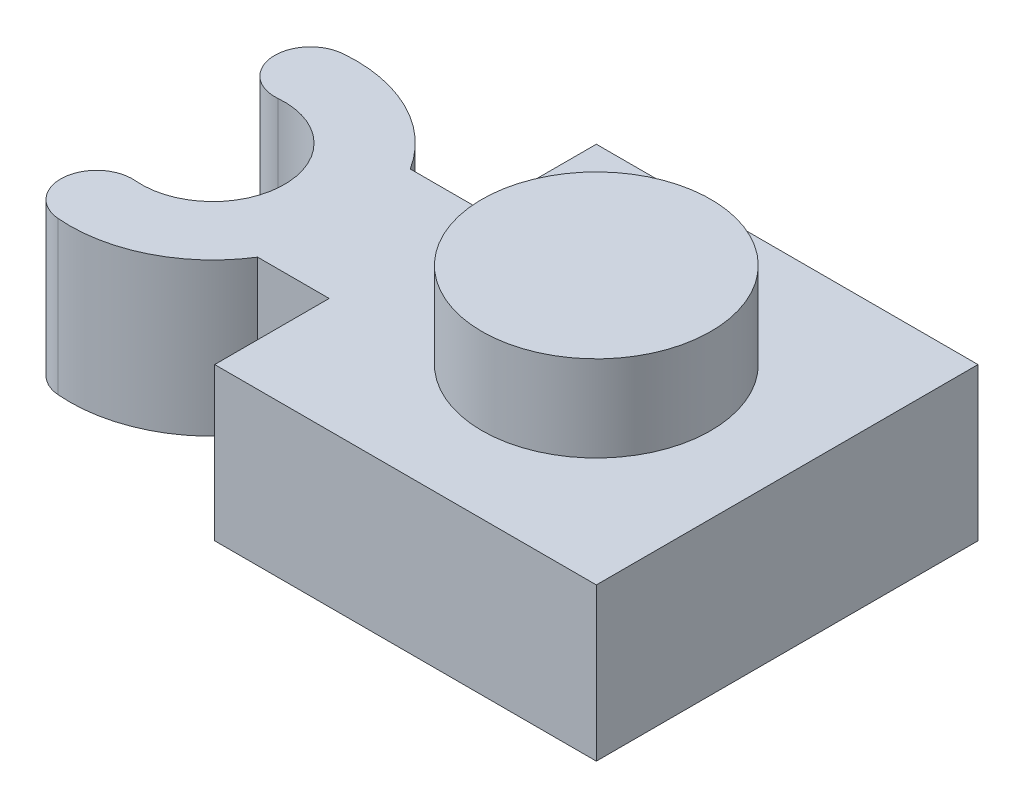
ISO-10303-21;
HEADER;
FILE_DESCRIPTION(('STEP AP214'),'2;1');
FILE_NAME('part.step','',(''),(''),'','','');
FILE_SCHEMA(('AUTOMOTIVE_DESIGN { 1 0 10303 214 1 1 1 1 }'));
ENDSEC;
DATA;
#1=APPLICATION_CONTEXT('core data for automotive mechanical design processes');
#2=APPLICATION_PROTOCOL_DEFINITION('international standard','automotive_design',2000,#1);
#3=PRODUCT_CONTEXT('',#1,'mechanical');
#4=PRODUCT('Part','Part','',(#3));
#5=PRODUCT_RELATED_PRODUCT_CATEGORY('part','',(#4));
#6=PRODUCT_DEFINITION_FORMATION('','',#4);
#7=PRODUCT_DEFINITION_CONTEXT('part definition',#1,'design');
#8=PRODUCT_DEFINITION('design','',#6,#7);
#9=PRODUCT_DEFINITION_SHAPE('','',#8);
#10=(LENGTH_UNIT() NAMED_UNIT(*) SI_UNIT(.MILLI.,.METRE.));
#11=(NAMED_UNIT(*) PLANE_ANGLE_UNIT() SI_UNIT($,.RADIAN.));
#12=(NAMED_UNIT(*) SI_UNIT($,.STERADIAN.) SOLID_ANGLE_UNIT());
#13=UNCERTAINTY_MEASURE_WITH_UNIT(LENGTH_MEASURE(1.E-05),#10,'distance_accuracy_value','');
#14=(GEOMETRIC_REPRESENTATION_CONTEXT(3) GLOBAL_UNCERTAINTY_ASSIGNED_CONTEXT((#13)) GLOBAL_UNIT_ASSIGNED_CONTEXT((#10,
#11,#12)) REPRESENTATION_CONTEXT('',''));
#15=CARTESIAN_POINT('',(0.,0.,0.));
#16=DIRECTION('',(0.,0.,1.));
#17=DIRECTION('',(1.,0.,0.));
#18=AXIS2_PLACEMENT_3D('',#15,#16,#17);
#19=CARTESIAN_POINT('',(0.,3.2,0.));
#20=DIRECTION('',(1.,0.,0.));
#21=DIRECTION('',(0.,0.,-1.));
#22=AXIS2_PLACEMENT_3D('',#19,#20,#21);
#23=PLANE('',#22);
#24=DIRECTION('',(0.,0.,1.));
#25=VECTOR('',#24,1.);
#26=CARTESIAN_POINT('',(0.,0.,0.));
#27=LINE('',#26,#25);
#28=CARTESIAN_POINT('',(0.,0.,-2.4));
#29=VERTEX_POINT('',#28);
#30=CARTESIAN_POINT('',(0.,0.,0.));
#31=VERTEX_POINT('',#30);
#32=EDGE_CURVE('E179',#29,#31,#27,.T.);
#33=ORIENTED_EDGE('',*,*,#32,.T.);
#34=DIRECTION('',(0.,-1.,0.));
#35=VECTOR('',#34,1.);
#36=CARTESIAN_POINT('',(0.,3.2,0.));
#37=LINE('',#36,#35);
#38=CARTESIAN_POINT('',(0.,3.2,0.));
#39=VERTEX_POINT('',#38);
#40=EDGE_CURVE('E11',#39,#31,#37,.T.);
#41=ORIENTED_EDGE('',*,*,#40,.F.);
#42=DIRECTION('',(0.,0.,1.));
#43=VECTOR('',#42,1.);
#44=CARTESIAN_POINT('',(0.,3.2,0.));
#45=LINE('',#44,#43);
#46=CARTESIAN_POINT('',(0.,3.2,-2.4));
#47=VERTEX_POINT('',#46);
#48=EDGE_CURVE('E215',#47,#39,#45,.T.);
#49=ORIENTED_EDGE('',*,*,#48,.F.);
#50=DIRECTION('',(0.,-1.,0.));
#51=VECTOR('',#50,1.);
#52=CARTESIAN_POINT('',(0.,3.2,-2.4));
#53=LINE('',#52,#51);
#54=EDGE_CURVE('E175',#47,#29,#53,.T.);
#55=ORIENTED_EDGE('',*,*,#54,.T.);
#56=EDGE_LOOP('',(#33,#41,#49,#55));
#57=FACE_BOUND('',#56,.T.);
#58=ADVANCED_FACE('F42',(#57),#23,.F.);
#59=CARTESIAN_POINT('',(0.,3.2,0.));
#60=DIRECTION('',(0.,0.,-1.));
#61=DIRECTION('',(-1.,0.,0.));
#62=AXIS2_PLACEMENT_3D('',#59,#60,#61);
#63=PLANE('',#62);
#64=DIRECTION('',(1.,0.,0.));
#65=VECTOR('',#64,1.);
#66=CARTESIAN_POINT('',(0.,0.,0.));
#67=LINE('',#66,#65);
#68=CARTESIAN_POINT('',(8.,0.,0.));
#69=VERTEX_POINT('',#68);
#70=EDGE_CURVE('E183',#31,#69,#67,.T.);
#71=ORIENTED_EDGE('',*,*,#70,.T.);
#72=DIRECTION('',(0.,-1.,0.));
#73=VECTOR('',#72,1.);
#74=CARTESIAN_POINT('',(8.,3.2,0.));
#75=LINE('',#74,#73);
#76=CARTESIAN_POINT('',(8.,3.2,0.));
#77=VERTEX_POINT('',#76);
#78=EDGE_CURVE('E50',#77,#69,#75,.T.);
#79=ORIENTED_EDGE('',*,*,#78,.F.);
#80=DIRECTION('',(1.,0.,0.));
#81=VECTOR('',#80,1.);
#82=CARTESIAN_POINT('',(0.,3.2,0.));
#83=LINE('',#82,#81);
#84=EDGE_CURVE('E119',#39,#77,#83,.T.);
#85=ORIENTED_EDGE('',*,*,#84,.F.);
#86=ORIENTED_EDGE('',*,*,#40,.T.);
#87=EDGE_LOOP('',(#71,#79,#85,#86));
#88=FACE_BOUND('',#87,.T.);
#89=ADVANCED_FACE('F395',(#88),#63,.F.);
#90=CARTESIAN_POINT('',(8.,3.2,0.));
#91=DIRECTION('',(-1.,0.,0.));
#92=DIRECTION('',(0.,0.,1.));
#93=AXIS2_PLACEMENT_3D('',#90,#91,#92);
#94=PLANE('',#93);
#95=DIRECTION('',(0.,0.,-1.));
#96=VECTOR('',#95,1.);
#97=CARTESIAN_POINT('',(8.,0.,0.));
#98=LINE('',#97,#96);
#99=CARTESIAN_POINT('',(8.,0.,-8.));
#100=VERTEX_POINT('',#99);
#101=EDGE_CURVE('E187',#69,#100,#98,.T.);
#102=ORIENTED_EDGE('',*,*,#101,.T.);
#103=DIRECTION('',(0.,-1.,0.));
#104=VECTOR('',#103,1.);
#105=CARTESIAN_POINT('',(8.,3.2,-8.));
#106=LINE('',#105,#104);
#107=CARTESIAN_POINT('',(8.,3.2,-8.));
#108=VERTEX_POINT('',#107);
#109=EDGE_CURVE('E242',#108,#100,#106,.T.);
#110=ORIENTED_EDGE('',*,*,#109,.F.);
#111=DIRECTION('',(0.,0.,-1.));
#112=VECTOR('',#111,1.);
#113=CARTESIAN_POINT('',(8.,3.2,0.));
#114=LINE('',#113,#112);
#115=EDGE_CURVE('E252',#77,#108,#114,.T.);
#116=ORIENTED_EDGE('',*,*,#115,.F.);
#117=ORIENTED_EDGE('',*,*,#78,.T.);
#118=EDGE_LOOP('',(#102,#110,#116,#117));
#119=FACE_BOUND('',#118,.T.);
#120=ADVANCED_FACE('F250',(#119),#94,.F.);
#121=CARTESIAN_POINT('',(0.,3.2,-8.));
#122=DIRECTION('',(0.,0.,1.));
#123=DIRECTION('',(1.,0.,0.));
#124=AXIS2_PLACEMENT_3D('',#121,#122,#123);
#125=PLANE('',#124);
#126=DIRECTION('',(-1.,0.,0.));
#127=VECTOR('',#126,1.);
#128=CARTESIAN_POINT('',(0.,0.,-8.));
#129=LINE('',#128,#127);
#130=CARTESIAN_POINT('',(0.,0.,-8.));
#131=VERTEX_POINT('',#130);
#132=EDGE_CURVE('E190',#100,#131,#129,.T.);
#133=ORIENTED_EDGE('',*,*,#132,.T.);
#134=DIRECTION('',(0.,-1.,0.));
#135=VECTOR('',#134,1.);
#136=CARTESIAN_POINT('',(0.,3.2,-8.));
#137=LINE('',#136,#135);
#138=CARTESIAN_POINT('',(0.,3.2,-8.));
#139=VERTEX_POINT('',#138);
#140=EDGE_CURVE('E238',#139,#131,#137,.T.);
#141=ORIENTED_EDGE('',*,*,#140,.F.);
#142=DIRECTION('',(-1.,0.,0.));
#143=VECTOR('',#142,1.);
#144=CARTESIAN_POINT('',(0.,3.2,-8.));
#145=LINE('',#144,#143);
#146=EDGE_CURVE('E271',#108,#139,#145,.T.);
#147=ORIENTED_EDGE('',*,*,#146,.F.);
#148=ORIENTED_EDGE('',*,*,#109,.T.);
#149=EDGE_LOOP('',(#133,#141,#147,#148));
#150=FACE_BOUND('',#149,.T.);
#151=ADVANCED_FACE('F261',(#150),#125,.F.);
#152=CARTESIAN_POINT('',(0.,3.2,-5.6));
#153=DIRECTION('',(1.,0.,0.));
#154=DIRECTION('',(0.,0.,-1.));
#155=AXIS2_PLACEMENT_3D('',#152,#153,#154);
#156=PLANE('',#155);
#157=DIRECTION('',(0.,0.,1.));
#158=VECTOR('',#157,1.);
#159=CARTESIAN_POINT('',(0.,0.,-5.6));
#160=LINE('',#159,#158);
#161=CARTESIAN_POINT('',(0.,0.,-5.6));
#162=VERTEX_POINT('',#161);
#163=EDGE_CURVE('E193',#131,#162,#160,.T.);
#164=ORIENTED_EDGE('',*,*,#163,.T.);
#165=DIRECTION('',(0.,-1.,0.));
#166=VECTOR('',#165,1.);
#167=CARTESIAN_POINT('',(0.,3.2,-5.6));
#168=LINE('',#167,#166);
#169=CARTESIAN_POINT('',(0.,3.2,-5.6));
#170=VERTEX_POINT('',#169);
#171=EDGE_CURVE('E234',#170,#162,#168,.T.);
#172=ORIENTED_EDGE('',*,*,#171,.F.);
#173=DIRECTION('',(0.,0.,1.));
#174=VECTOR('',#173,1.);
#175=CARTESIAN_POINT('',(0.,3.2,-5.6));
#176=LINE('',#175,#174);
#177=EDGE_CURVE('E267',#139,#170,#176,.T.);
#178=ORIENTED_EDGE('',*,*,#177,.F.);
#179=ORIENTED_EDGE('',*,*,#140,.T.);
#180=EDGE_LOOP('',(#164,#172,#178,#179));
#181=FACE_BOUND('',#180,.T.);
#182=ADVANCED_FACE('F265',(#181),#156,.F.);
#183=CARTESIAN_POINT('',(0.,3.2,-5.6));
#184=DIRECTION('',(0.,0.,1.));
#185=DIRECTION('',(1.,0.,0.));
#186=AXIS2_PLACEMENT_3D('',#183,#184,#185);
#187=PLANE('',#186);
#188=DIRECTION('',(-1.,0.,0.));
#189=VECTOR('',#188,1.);
#190=CARTESIAN_POINT('',(0.,0.,-5.6));
#191=LINE('',#190,#189);
#192=CARTESIAN_POINT('',(-1.5,0.,-5.6));
#193=VERTEX_POINT('',#192);
#194=EDGE_CURVE('E196',#162,#193,#191,.T.);
#195=ORIENTED_EDGE('',*,*,#194,.T.);
#196=DIRECTION('',(0.,-1.,0.));
#197=VECTOR('',#196,1.);
#198=CARTESIAN_POINT('',(-1.5,3.2,-5.6));
#199=LINE('',#198,#197);
#200=CARTESIAN_POINT('',(-1.5,3.2,-5.6));
#201=VERTEX_POINT('',#200);
#202=EDGE_CURVE('E230',#201,#193,#199,.T.);
#203=ORIENTED_EDGE('',*,*,#202,.F.);
#204=DIRECTION('',(-1.,0.,0.));
#205=VECTOR('',#204,1.);
#206=CARTESIAN_POINT('',(0.,3.2,-5.6));
#207=LINE('',#206,#205);
#208=EDGE_CURVE('E270',#170,#201,#207,.T.);
#209=ORIENTED_EDGE('',*,*,#208,.F.);
#210=ORIENTED_EDGE('',*,*,#171,.T.);
#211=EDGE_LOOP('',(#195,#203,#209,#210));
#212=FACE_BOUND('',#211,.T.);
#213=ADVANCED_FACE('F408',(#212),#187,.F.);
#214=CARTESIAN_POINT('',(-4.0377155080899,3.2,-4.));
#215=DIRECTION('',(0.,-1.,0.));
#216=DIRECTION('',(0.,0.,-1.));
#217=AXIS2_PLACEMENT_3D('',#214,#215,#216);
#218=CYLINDRICAL_SURFACE('',#217,3.);
#219=CARTESIAN_POINT('',(-4.0377155080899,0.,-4.));
#220=DIRECTION('',(0.,1.,0.));
#221=DIRECTION('',(0.,0.,1.));
#222=AXIS2_PLACEMENT_3D('',#219,#220,#221);
#223=CIRCLE('',#222,3.);
#224=CARTESIAN_POINT('',(-4.29918273633287,0.,-6.98858409427524));
#225=VERTEX_POINT('',#224);
#226=EDGE_CURVE('E199',#193,#225,#223,.T.);
#227=ORIENTED_EDGE('',*,*,#226,.T.);
#228=DIRECTION('',(0.,-1.,0.));
#229=VECTOR('',#228,1.);
#230=CARTESIAN_POINT('',(-4.29918273633287,3.2,-6.98858409427524));
#231=LINE('',#230,#229);
#232=CARTESIAN_POINT('',(-4.29918273633287,3.2,-6.98858409427524));
#233=VERTEX_POINT('',#232);
#234=EDGE_CURVE('E226',#233,#225,#231,.T.);
#235=ORIENTED_EDGE('',*,*,#234,.F.);
#236=CARTESIAN_POINT('',(-4.0377155080899,3.2,-4.));
#237=DIRECTION('',(0.,1.,0.));
#238=DIRECTION('',(0.,0.,1.));
#239=AXIS2_PLACEMENT_3D('',#236,#237,#238);
#240=CIRCLE('',#239,3.);
#241=EDGE_CURVE('E275',#201,#233,#240,.T.);
#242=ORIENTED_EDGE('',*,*,#241,.F.);
#243=ORIENTED_EDGE('',*,*,#202,.T.);
#244=EDGE_LOOP('',(#227,#235,#242,#243));
#245=FACE_BOUND('',#244,.T.);
#246=ADVANCED_FACE('F411',(#245),#218,.T.);
#247=CARTESIAN_POINT('',(-4.23381592927213,3.2,-6.24143807070644));
#248=DIRECTION('',(0.,-1.,0.));
#249=DIRECTION('',(0.,0.,-1.));
#250=AXIS2_PLACEMENT_3D('',#247,#248,#249);
#251=CYLINDRICAL_SURFACE('',#250,0.750000000000002);
#252=CARTESIAN_POINT('',(-4.23381592927213,0.,-6.24143807070644));
#253=DIRECTION('',(0.,1.,0.));
#254=DIRECTION('',(0.,0.,1.));
#255=AXIS2_PLACEMENT_3D('',#252,#253,#254);
#256=CIRCLE('',#255,0.750000000000002);
#257=CARTESIAN_POINT('',(-4.16844912221139,0.,-5.49429204713763));
#258=VERTEX_POINT('',#257);
#259=EDGE_CURVE('E202',#225,#258,#256,.T.);
#260=ORIENTED_EDGE('',*,*,#259,.T.);
#261=DIRECTION('',(0.,-1.,0.));
#262=VECTOR('',#261,1.);
#263=CARTESIAN_POINT('',(-4.16844912221139,3.2,-5.49429204713763));
#264=LINE('',#263,#262);
#265=CARTESIAN_POINT('',(-4.16844912221139,3.2,-5.49429204713763));
#266=VERTEX_POINT('',#265);
#267=EDGE_CURVE('E222',#266,#258,#264,.T.);
#268=ORIENTED_EDGE('',*,*,#267,.F.);
#269=CARTESIAN_POINT('',(-4.23381592927213,3.2,-6.24143807070644));
#270=DIRECTION('',(0.,1.,0.));
#271=DIRECTION('',(0.,0.,1.));
#272=AXIS2_PLACEMENT_3D('',#269,#270,#271);
#273=CIRCLE('',#272,0.750000000000002);
#274=EDGE_CURVE('E282',#233,#266,#273,.T.);
#275=ORIENTED_EDGE('',*,*,#274,.F.);
#276=ORIENTED_EDGE('',*,*,#234,.T.);
#277=EDGE_LOOP('',(#260,#268,#275,#276));
#278=FACE_BOUND('',#277,.T.);
#279=ADVANCED_FACE('F290',(#278),#251,.T.);
#280=CARTESIAN_POINT('',(-4.0377155080899,3.2,-4.));
#281=DIRECTION('',(0.,-1.,0.));
#282=DIRECTION('',(0.,0.,-1.));
#283=AXIS2_PLACEMENT_3D('',#280,#281,#282);
#284=CYLINDRICAL_SURFACE('',#283,1.5);
#285=CARTESIAN_POINT('',(-4.0377155080899,0.,-4.));
#286=DIRECTION('',(0.,-1.,0.));
#287=DIRECTION('',(0.,0.,1.));
#288=AXIS2_PLACEMENT_3D('',#285,#286,#287);
#289=CIRCLE('',#288,1.5);
#290=CARTESIAN_POINT('',(-4.16844912221139,0.,-2.50570795286238));
#291=VERTEX_POINT('',#290);
#292=EDGE_CURVE('E205',#258,#291,#289,.T.);
#293=ORIENTED_EDGE('',*,*,#292,.T.);
#294=DIRECTION('',(0.,-1.,0.));
#295=VECTOR('',#294,1.);
#296=CARTESIAN_POINT('',(-4.16844912221139,3.2,-2.50570795286238));
#297=LINE('',#296,#295);
#298=CARTESIAN_POINT('',(-4.16844912221139,3.2,-2.50570795286238));
#299=VERTEX_POINT('',#298);
#300=EDGE_CURVE('E168',#299,#291,#297,.T.);
#301=ORIENTED_EDGE('',*,*,#300,.F.);
#302=CARTESIAN_POINT('',(-4.0377155080899,3.2,-4.));
#303=DIRECTION('',(0.,-1.,0.));
#304=DIRECTION('',(0.,0.,1.));
#305=AXIS2_PLACEMENT_3D('',#302,#303,#304);
#306=CIRCLE('',#305,1.5);
#307=EDGE_CURVE('E154',#266,#299,#306,.T.);
#308=ORIENTED_EDGE('',*,*,#307,.F.);
#309=ORIENTED_EDGE('',*,*,#267,.T.);
#310=EDGE_LOOP('',(#293,#301,#308,#309));
#311=FACE_BOUND('',#310,.T.);
#312=ADVANCED_FACE('F294',(#311),#284,.F.);
#313=CARTESIAN_POINT('',(-4.23381592927213,3.2,-1.75856192929357));
#314=DIRECTION('',(0.,-1.,0.));
#315=DIRECTION('',(0.,0.,-1.));
#316=AXIS2_PLACEMENT_3D('',#313,#314,#315);
#317=CYLINDRICAL_SURFACE('',#316,0.75);
#318=CARTESIAN_POINT('',(-4.23381592927213,0.,-1.75856192929357));
#319=DIRECTION('',(0.,1.,0.));
#320=DIRECTION('',(0.,0.,1.));
#321=AXIS2_PLACEMENT_3D('',#318,#319,#320);
#322=CIRCLE('',#321,0.75);
#323=CARTESIAN_POINT('',(-4.29918273633287,0.,-1.01141590572476));
#324=VERTEX_POINT('',#323);
#325=EDGE_CURVE('E164',#291,#324,#322,.T.);
#326=ORIENTED_EDGE('',*,*,#325,.T.);
#327=DIRECTION('',(0.,-1.,0.));
#328=VECTOR('',#327,1.);
#329=CARTESIAN_POINT('',(-4.29918273633287,3.2,-1.01141590572476));
#330=LINE('',#329,#328);
#331=CARTESIAN_POINT('',(-4.29918273633287,3.2,-1.01141590572476));
#332=VERTEX_POINT('',#331);
#333=EDGE_CURVE('E161',#332,#324,#330,.T.);
#334=ORIENTED_EDGE('',*,*,#333,.F.);
#335=CARTESIAN_POINT('',(-4.23381592927213,3.2,-1.75856192929357));
#336=DIRECTION('',(0.,1.,0.));
#337=DIRECTION('',(0.,0.,1.));
#338=AXIS2_PLACEMENT_3D('',#335,#336,#337);
#339=CIRCLE('',#338,0.75);
#340=EDGE_CURVE('E147',#299,#332,#339,.T.);
#341=ORIENTED_EDGE('',*,*,#340,.F.);
#342=ORIENTED_EDGE('',*,*,#300,.T.);
#343=EDGE_LOOP('',(#326,#334,#341,#342));
#344=FACE_BOUND('',#343,.T.);
#345=ADVANCED_FACE('F162',(#344),#317,.T.);
#346=CARTESIAN_POINT('',(-4.0377155080899,3.2,-4.));
#347=DIRECTION('',(0.,-1.,0.));
#348=DIRECTION('',(0.,0.,-1.));
#349=AXIS2_PLACEMENT_3D('',#346,#347,#348);
#350=CYLINDRICAL_SURFACE('',#349,3.);
#351=CARTESIAN_POINT('',(-4.0377155080899,0.,-4.));
#352=DIRECTION('',(0.,1.,0.));
#353=DIRECTION('',(0.,0.,1.));
#354=AXIS2_PLACEMENT_3D('',#351,#352,#353);
#355=CIRCLE('',#354,3.);
#356=CARTESIAN_POINT('',(-1.5,0.,-2.4));
#357=VERTEX_POINT('',#356);
#358=EDGE_CURVE('E210',#324,#357,#355,.T.);
#359=ORIENTED_EDGE('',*,*,#358,.T.);
#360=DIRECTION('',(0.,-1.,0.));
#361=VECTOR('',#360,1.);
#362=CARTESIAN_POINT('',(-1.5,3.2,-2.4));
#363=LINE('',#362,#361);
#364=CARTESIAN_POINT('',(-1.5,3.2,-2.4));
#365=VERTEX_POINT('',#364);
#366=EDGE_CURVE('E169',#365,#357,#363,.T.);
#367=ORIENTED_EDGE('',*,*,#366,.F.);
#368=CARTESIAN_POINT('',(-4.0377155080899,3.2,-4.));
#369=DIRECTION('',(0.,1.,0.));
#370=DIRECTION('',(0.,0.,1.));
#371=AXIS2_PLACEMENT_3D('',#368,#369,#370);
#372=CIRCLE('',#371,3.);
#373=EDGE_CURVE('E151',#332,#365,#372,.T.);
#374=ORIENTED_EDGE('',*,*,#373,.F.);
#375=ORIENTED_EDGE('',*,*,#333,.T.);
#376=EDGE_LOOP('',(#359,#367,#374,#375));
#377=FACE_BOUND('',#376,.T.);
#378=ADVANCED_FACE('F171',(#377),#350,.T.);
#379=CARTESIAN_POINT('',(0.,3.2,-2.4));
#380=DIRECTION('',(0.,0.,-1.));
#381=DIRECTION('',(-1.,0.,0.));
#382=AXIS2_PLACEMENT_3D('',#379,#380,#381);
#383=PLANE('',#382);
#384=DIRECTION('',(1.,0.,0.));
#385=VECTOR('',#384,1.);
#386=CARTESIAN_POINT('',(0.,0.,-2.4));
#387=LINE('',#386,#385);
#388=EDGE_CURVE('E111',#357,#29,#387,.T.);
#389=ORIENTED_EDGE('',*,*,#388,.T.);
#390=ORIENTED_EDGE('',*,*,#54,.F.);
#391=DIRECTION('',(1.,0.,0.));
#392=VECTOR('',#391,1.);
#393=CARTESIAN_POINT('',(0.,3.2,-2.4));
#394=LINE('',#393,#392);
#395=EDGE_CURVE('E66',#365,#47,#394,.T.);
#396=ORIENTED_EDGE('',*,*,#395,.F.);
#397=ORIENTED_EDGE('',*,*,#366,.T.);
#398=EDGE_LOOP('',(#389,#390,#396,#397));
#399=FACE_BOUND('',#398,.T.);
#400=ADVANCED_FACE('F295',(#399),#383,.F.);
#401=CARTESIAN_POINT('',(-4.0377155080899,3.2,-4.));
#402=DIRECTION('',(0.,1.,0.));
#403=DIRECTION('',(0.,0.,1.));
#404=AXIS2_PLACEMENT_3D('',#401,#402,#403);
#405=PLANE('',#404);
#406=CARTESIAN_POINT('',(4.,3.2,-4.));
#407=DIRECTION('',(0.,1.,0.));
#408=DIRECTION('',(0.,0.,1.));
#409=AXIS2_PLACEMENT_3D('',#406,#407,#408);
#410=CIRCLE('',#409,2.4);
#411=CARTESIAN_POINT('',(4.,3.2,-1.6));
#412=VERTEX_POINT('',#411);
#413=EDGE_CURVE('E304',#412,#412,#410,.T.);
#414=ORIENTED_EDGE('',*,*,#413,.F.);
#415=EDGE_LOOP('',(#414));
#416=FACE_BOUND('',#415,.T.);
#417=ORIENTED_EDGE('',*,*,#48,.T.);
#418=ORIENTED_EDGE('',*,*,#84,.T.);
#419=ORIENTED_EDGE('',*,*,#115,.T.);
#420=ORIENTED_EDGE('',*,*,#146,.T.);
#421=ORIENTED_EDGE('',*,*,#177,.T.);
#422=ORIENTED_EDGE('',*,*,#208,.T.);
#423=ORIENTED_EDGE('',*,*,#241,.T.);
#424=ORIENTED_EDGE('',*,*,#274,.T.);
#425=ORIENTED_EDGE('',*,*,#307,.T.);
#426=ORIENTED_EDGE('',*,*,#340,.T.);
#427=ORIENTED_EDGE('',*,*,#373,.T.);
#428=ORIENTED_EDGE('',*,*,#395,.T.);
#429=EDGE_LOOP('',(#417,#418,#419,#420,#421,#422,#423,#424,#425,#426,#427,#428));
#430=FACE_BOUND('',#429,.T.);
#431=ADVANCED_FACE('F149',(#416,#430),#405,.T.);
#432=CARTESIAN_POINT('',(-4.0377155080899,0.,-4.));
#433=DIRECTION('',(0.,1.,0.));
#434=DIRECTION('',(0.,0.,1.));
#435=AXIS2_PLACEMENT_3D('',#432,#433,#434);
#436=PLANE('',#435);
#437=DIRECTION('',(1.,0.,0.));
#438=VECTOR('',#437,1.);
#439=CARTESIAN_POINT('',(1.6,0.,-6.4));
#440=LINE('',#439,#438);
#441=CARTESIAN_POINT('',(1.6,0.,-6.4));
#442=VERTEX_POINT('',#441);
#443=CARTESIAN_POINT('',(6.4,0.,-6.4));
#444=VERTEX_POINT('',#443);
#445=EDGE_CURVE('E336',#442,#444,#440,.T.);
#446=ORIENTED_EDGE('',*,*,#445,.F.);
#447=DIRECTION('',(0.,0.,-1.));
#448=VECTOR('',#447,1.);
#449=CARTESIAN_POINT('',(1.6,0.,-1.6));
#450=LINE('',#449,#448);
#451=CARTESIAN_POINT('',(1.6,0.,-1.6));
#452=VERTEX_POINT('',#451);
#453=EDGE_CURVE('E57',#452,#442,#450,.T.);
#454=ORIENTED_EDGE('',*,*,#453,.F.);
#455=DIRECTION('',(-1.,0.,0.));
#456=VECTOR('',#455,1.);
#457=CARTESIAN_POINT('',(1.6,0.,-1.6));
#458=LINE('',#457,#456);
#459=CARTESIAN_POINT('',(6.4,0.,-1.6));
#460=VERTEX_POINT('',#459);
#461=EDGE_CURVE('E327',#460,#452,#458,.T.);
#462=ORIENTED_EDGE('',*,*,#461,.F.);
#463=DIRECTION('',(0.,0.,1.));
#464=VECTOR('',#463,1.);
#465=CARTESIAN_POINT('',(6.4,0.,-1.6));
#466=LINE('',#465,#464);
#467=EDGE_CURVE('E332',#444,#460,#466,.T.);
#468=ORIENTED_EDGE('',*,*,#467,.F.);
#469=EDGE_LOOP('',(#446,#454,#462,#468));
#470=FACE_BOUND('',#469,.T.);
#471=ORIENTED_EDGE('',*,*,#32,.F.);
#472=ORIENTED_EDGE('',*,*,#388,.F.);
#473=ORIENTED_EDGE('',*,*,#358,.F.);
#474=ORIENTED_EDGE('',*,*,#325,.F.);
#475=ORIENTED_EDGE('',*,*,#292,.F.);
#476=ORIENTED_EDGE('',*,*,#259,.F.);
#477=ORIENTED_EDGE('',*,*,#226,.F.);
#478=ORIENTED_EDGE('',*,*,#194,.F.);
#479=ORIENTED_EDGE('',*,*,#163,.F.);
#480=ORIENTED_EDGE('',*,*,#132,.F.);
#481=ORIENTED_EDGE('',*,*,#101,.F.);
#482=ORIENTED_EDGE('',*,*,#70,.F.);
#483=EDGE_LOOP('',(#471,#472,#473,#474,#475,#476,#477,#478,#479,#480,#481,#482));
#484=FACE_BOUND('',#483,.T.);
#485=ADVANCED_FACE('F256',(#470,#484),#436,.F.);
#486=CARTESIAN_POINT('',(4.,5.,-4.));
#487=DIRECTION('',(0.,-1.,0.));
#488=DIRECTION('',(0.,0.,-1.));
#489=AXIS2_PLACEMENT_3D('',#486,#487,#488);
#490=CYLINDRICAL_SURFACE('',#489,2.4);
#491=CARTESIAN_POINT('',(4.,5.,-4.));
#492=DIRECTION('',(0.,1.,0.));
#493=DIRECTION('',(0.,0.,1.));
#494=AXIS2_PLACEMENT_3D('',#491,#492,#493);
#495=CIRCLE('',#494,2.4);
#496=CARTESIAN_POINT('',(4.,5.,-1.6));
#497=VERTEX_POINT('',#496);
#498=EDGE_CURVE('E184',#497,#497,#495,.T.);
#499=ORIENTED_EDGE('',*,*,#498,.F.);
#500=EDGE_LOOP('',(#499));
#501=FACE_BOUND('',#500,.T.);
#502=ORIENTED_EDGE('',*,*,#413,.T.);
#503=EDGE_LOOP('',(#502));
#504=FACE_BOUND('',#503,.T.);
#505=ADVANCED_FACE('F428',(#501,#504),#490,.T.);
#506=CARTESIAN_POINT('',(4.,5.,-4.));
#507=DIRECTION('',(0.,1.,0.));
#508=DIRECTION('',(0.,0.,1.));
#509=AXIS2_PLACEMENT_3D('',#506,#507,#508);
#510=PLANE('',#509);
#511=ORIENTED_EDGE('',*,*,#498,.T.);
#512=EDGE_LOOP('',(#511));
#513=FACE_BOUND('',#512,.T.);
#514=ADVANCED_FACE('F434',(#513),#510,.T.);
#515=CARTESIAN_POINT('',(1.6,1.8,-1.6));
#516=DIRECTION('',(-1.,0.,0.));
#517=DIRECTION('',(0.,0.,1.));
#518=AXIS2_PLACEMENT_3D('',#515,#516,#517);
#519=PLANE('',#518);
#520=ORIENTED_EDGE('',*,*,#453,.T.);
#521=DIRECTION('',(0.,-1.,0.));
#522=VECTOR('',#521,1.);
#523=CARTESIAN_POINT('',(1.6,1.8,-6.4));
#524=LINE('',#523,#522);
#525=CARTESIAN_POINT('',(1.6,1.8,-6.4));
#526=VERTEX_POINT('',#525);
#527=EDGE_CURVE('E313',#526,#442,#524,.T.);
#528=ORIENTED_EDGE('',*,*,#527,.F.);
#529=DIRECTION('',(0.,0.,-1.));
#530=VECTOR('',#529,1.);
#531=CARTESIAN_POINT('',(1.6,1.8,-1.6));
#532=LINE('',#531,#530);
#533=CARTESIAN_POINT('',(1.6,1.8,-1.6));
#534=VERTEX_POINT('',#533);
#535=EDGE_CURVE('E331',#534,#526,#532,.T.);
#536=ORIENTED_EDGE('',*,*,#535,.F.);
#537=DIRECTION('',(0.,-1.,0.));
#538=VECTOR('',#537,1.);
#539=CARTESIAN_POINT('',(1.6,1.8,-1.6));
#540=LINE('',#539,#538);
#541=EDGE_CURVE('E309',#534,#452,#540,.T.);
#542=ORIENTED_EDGE('',*,*,#541,.T.);
#543=EDGE_LOOP('',(#520,#528,#536,#542));
#544=FACE_BOUND('',#543,.T.);
#545=ADVANCED_FACE('F363',(#544),#519,.F.);
#546=CARTESIAN_POINT('',(1.6,1.8,-1.6));
#547=DIRECTION('',(0.,0.,1.));
#548=DIRECTION('',(1.,0.,0.));
#549=AXIS2_PLACEMENT_3D('',#546,#547,#548);
#550=PLANE('',#549);
#551=ORIENTED_EDGE('',*,*,#461,.T.);
#552=ORIENTED_EDGE('',*,*,#541,.F.);
#553=DIRECTION('',(-1.,0.,0.));
#554=VECTOR('',#553,1.);
#555=CARTESIAN_POINT('',(1.6,1.8,-1.6));
#556=LINE('',#555,#554);
#557=CARTESIAN_POINT('',(6.4,1.8,-1.6));
#558=VERTEX_POINT('',#557);
#559=EDGE_CURVE('E317',#558,#534,#556,.T.);
#560=ORIENTED_EDGE('',*,*,#559,.F.);
#561=DIRECTION('',(0.,-1.,0.));
#562=VECTOR('',#561,1.);
#563=CARTESIAN_POINT('',(6.4,1.8,-1.6));
#564=LINE('',#563,#562);
#565=EDGE_CURVE('E321',#558,#460,#564,.T.);
#566=ORIENTED_EDGE('',*,*,#565,.T.);
#567=EDGE_LOOP('',(#551,#552,#560,#566));
#568=FACE_BOUND('',#567,.T.);
#569=ADVANCED_FACE('F374',(#568),#550,.F.);
#570=CARTESIAN_POINT('',(6.4,1.8,-1.6));
#571=DIRECTION('',(1.,0.,0.));
#572=DIRECTION('',(0.,0.,-1.));
#573=AXIS2_PLACEMENT_3D('',#570,#571,#572);
#574=PLANE('',#573);
#575=ORIENTED_EDGE('',*,*,#467,.T.);
#576=ORIENTED_EDGE('',*,*,#565,.F.);
#577=DIRECTION('',(0.,0.,1.));
#578=VECTOR('',#577,1.);
#579=CARTESIAN_POINT('',(6.4,1.8,-1.6));
#580=LINE('',#579,#578);
#581=CARTESIAN_POINT('',(6.4,1.8,-6.4));
#582=VERTEX_POINT('',#581);
#583=EDGE_CURVE('E345',#582,#558,#580,.T.);
#584=ORIENTED_EDGE('',*,*,#583,.F.);
#585=DIRECTION('',(0.,-1.,0.));
#586=VECTOR('',#585,1.);
#587=CARTESIAN_POINT('',(6.4,1.8,-6.4));
#588=LINE('',#587,#586);
#589=EDGE_CURVE('E316',#582,#444,#588,.T.);
#590=ORIENTED_EDGE('',*,*,#589,.T.);
#591=EDGE_LOOP('',(#575,#576,#584,#590));
#592=FACE_BOUND('',#591,.T.);
#593=ADVANCED_FACE('F379',(#592),#574,.F.);
#594=CARTESIAN_POINT('',(1.6,1.8,-6.4));
#595=DIRECTION('',(0.,0.,-1.));
#596=DIRECTION('',(-1.,0.,0.));
#597=AXIS2_PLACEMENT_3D('',#594,#595,#596);
#598=PLANE('',#597);
#599=ORIENTED_EDGE('',*,*,#445,.T.);
#600=ORIENTED_EDGE('',*,*,#589,.F.);
#601=DIRECTION('',(1.,0.,0.));
#602=VECTOR('',#601,1.);
#603=CARTESIAN_POINT('',(1.6,1.8,-6.4));
#604=LINE('',#603,#602);
#605=EDGE_CURVE('E349',#526,#582,#604,.T.);
#606=ORIENTED_EDGE('',*,*,#605,.F.);
#607=ORIENTED_EDGE('',*,*,#527,.T.);
#608=EDGE_LOOP('',(#599,#600,#606,#607));
#609=FACE_BOUND('',#608,.T.);
#610=ADVANCED_FACE('F384',(#609),#598,.F.);
#611=CARTESIAN_POINT('',(0.,1.8,0.));
#612=DIRECTION('',(0.,-1.,0.));
#613=DIRECTION('',(0.,0.,-1.));
#614=AXIS2_PLACEMENT_3D('',#611,#612,#613);
#615=PLANE('',#614);
#616=ORIENTED_EDGE('',*,*,#535,.T.);
#617=ORIENTED_EDGE('',*,*,#605,.T.);
#618=ORIENTED_EDGE('',*,*,#583,.T.);
#619=ORIENTED_EDGE('',*,*,#559,.T.);
#620=EDGE_LOOP('',(#616,#617,#618,#619));
#621=FACE_BOUND('',#620,.T.);
#622=ADVANCED_FACE('F358',(#621),#615,.T.);
#623=CLOSED_SHELL('',(#58,#89,#120,#151,#182,#213,#246,#279,#312,#345,#378,#400,#431,#485,#505,
#514,#545,#569,#593,#610,#622));
#624=MANIFOLD_SOLID_BREP('B2',#623);
#625=ADVANCED_BREP_SHAPE_REPRESENTATION('',(#18,#624),#14);
#626=SHAPE_DEFINITION_REPRESENTATION(#9,#625);
ENDSEC;
END-ISO-10303-21;
